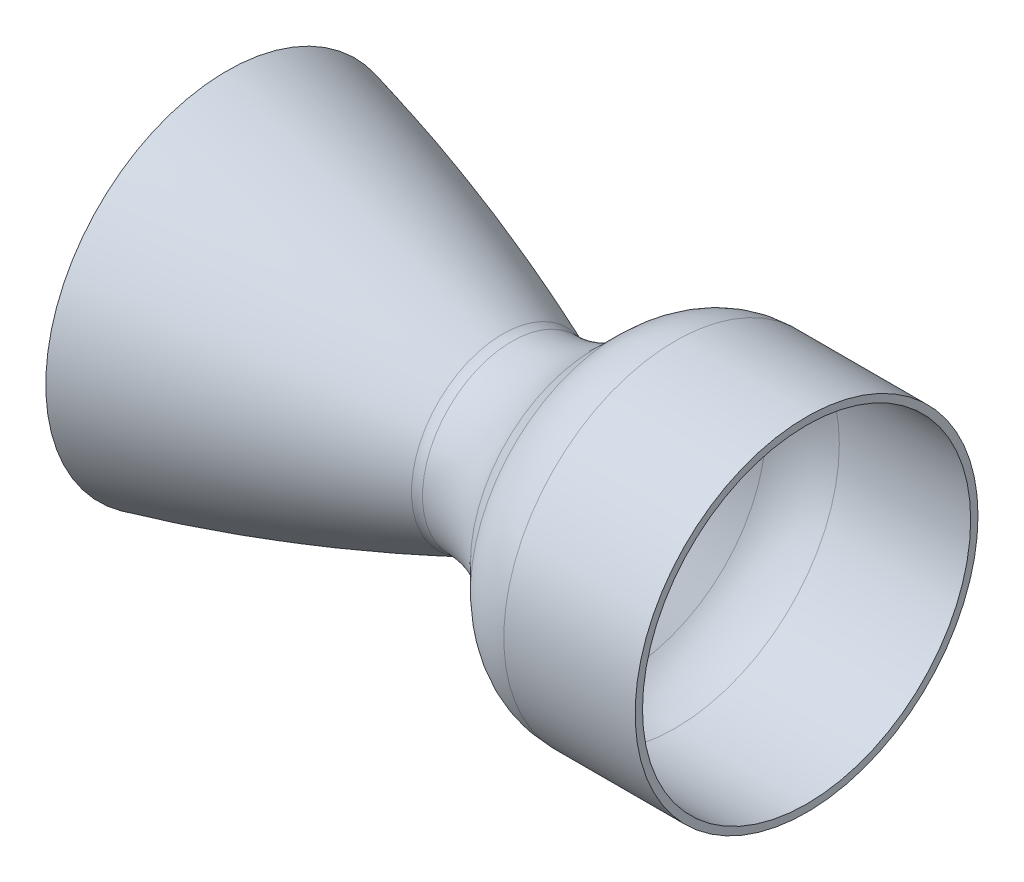
ISO-10303-21;
HEADER;
FILE_DESCRIPTION(('STEP AP214'),'2;1');
FILE_NAME('part.step','',(''),(''),'','','');
FILE_SCHEMA(('AUTOMOTIVE_DESIGN { 1 0 10303 214 1 1 1 1 }'));
ENDSEC;
DATA;
#1=APPLICATION_CONTEXT('core data for automotive mechanical design processes');
#2=APPLICATION_PROTOCOL_DEFINITION('international standard','automotive_design',2000,#1);
#3=PRODUCT_CONTEXT('',#1,'mechanical');
#4=PRODUCT('Part','Part','',(#3));
#5=PRODUCT_RELATED_PRODUCT_CATEGORY('part','',(#4));
#6=PRODUCT_DEFINITION_FORMATION('','',#4);
#7=PRODUCT_DEFINITION_CONTEXT('part definition',#1,'design');
#8=PRODUCT_DEFINITION('design','',#6,#7);
#9=PRODUCT_DEFINITION_SHAPE('','',#8);
#10=(LENGTH_UNIT() NAMED_UNIT(*) SI_UNIT(.MILLI.,.METRE.));
#11=(NAMED_UNIT(*) PLANE_ANGLE_UNIT() SI_UNIT($,.RADIAN.));
#12=(NAMED_UNIT(*) SI_UNIT($,.STERADIAN.) SOLID_ANGLE_UNIT());
#13=UNCERTAINTY_MEASURE_WITH_UNIT(LENGTH_MEASURE(1.E-05),#10,'distance_accuracy_value','');
#14=(GEOMETRIC_REPRESENTATION_CONTEXT(3) GLOBAL_UNCERTAINTY_ASSIGNED_CONTEXT((#13)) GLOBAL_UNIT_ASSIGNED_CONTEXT((#10,
#11,#12)) REPRESENTATION_CONTEXT('',''));
#15=CARTESIAN_POINT('',(0.,0.,0.));
#16=DIRECTION('',(0.,0.,1.));
#17=DIRECTION('',(1.,0.,0.));
#18=AXIS2_PLACEMENT_3D('',#15,#16,#17);
#19=CARTESIAN_POINT('',(1.63098502535199,0.,0.));
#20=DIRECTION('',(1.,0.,0.));
#21=DIRECTION('',(0.,0.,-1.));
#22=AXIS2_PLACEMENT_3D('',#19,#20,#21);
#23=TOROIDAL_SURFACE('',#22,15.4784,3.2784);
#24=CARTESIAN_POINT('',(1.63098502535199,0.,0.));
#25=DIRECTION('',(1.,0.,0.));
#26=DIRECTION('',(0.,0.,-1.));
#27=AXIS2_PLACEMENT_3D('',#24,#25,#26);
#28=CIRCLE('',#27,12.2);
#29=CARTESIAN_POINT('',(1.63098502535199,0.,-12.2));
#30=VERTEX_POINT('',#29);
#31=EDGE_CURVE('E100',#30,#30,#28,.T.);
#32=ORIENTED_EDGE('',*,*,#31,.F.);
#33=EDGE_LOOP('',(#32));
#34=FACE_BOUND('',#33,.T.);
#35=CARTESIAN_POINT('',(0.381213777428943,0.,0.));
#36=DIRECTION('',(1.,0.,0.));
#37=DIRECTION('',(0.,0.,-1.));
#38=AXIS2_PLACEMENT_3D('',#35,#36,#37);
#39=CIRCLE('',#38,12.4475620980553);
#40=CARTESIAN_POINT('',(0.381213777428943,0.,-12.4475620980553));
#41=VERTEX_POINT('',#40);
#42=EDGE_CURVE('E10',#41,#41,#39,.T.);
#43=ORIENTED_EDGE('',*,*,#42,.T.);
#44=EDGE_LOOP('',(#43));
#45=FACE_BOUND('',#44,.T.);
#46=ADVANCED_FACE('F41',(#34,#45),#23,.F.);
#47=CARTESIAN_POINT('',(0.381213777428944,12.4475620980553,0.));
#48=CARTESIAN_POINT('',(-18.5503141448873,20.2544105180687,0.));
#49=CARTESIAN_POINT('',(-37.2633725030895,24.7313471875832,0.));
#50=B_SPLINE_CURVE_WITH_KNOTS('',2,(#47,#48,#49),.UNSPECIFIED.,.F.,.F.,(3,3),(0.,1.),.UNSPECIFIED.);
#51=CARTESIAN_POINT('',(0.,0.,0.));
#52=DIRECTION('',(1.,0.,0.));
#53=AXIS1_PLACEMENT('',#51,#52);
#54=SURFACE_OF_REVOLUTION('',#50,#53);
#55=CARTESIAN_POINT('',(-37.2633725030895,0.,0.));
#56=DIRECTION('',(1.,0.,0.));
#57=DIRECTION('',(0.,0.,-1.));
#58=AXIS2_PLACEMENT_3D('',#55,#56,#57);
#59=CIRCLE('',#58,24.7313471875832);
#60=CARTESIAN_POINT('',(-37.2633725030895,0.,-24.7313471875832));
#61=VERTEX_POINT('',#60);
#62=EDGE_CURVE('E48',#61,#61,#59,.T.);
#63=ORIENTED_EDGE('',*,*,#62,.T.);
#64=EDGE_LOOP('',(#63));
#65=FACE_BOUND('',#64,.T.);
#66=ORIENTED_EDGE('',*,*,#42,.F.);
#67=EDGE_LOOP('',(#66));
#68=FACE_BOUND('',#67,.T.);
#69=ADVANCED_FACE('F124',(#65,#68),#54,.F.);
#70=CARTESIAN_POINT('',(-37.4960274637776,0.,0.));
#71=DIRECTION('',(1.,0.,0.));
#72=DIRECTION('',(0.,0.,-1.));
#73=AXIS2_PLACEMENT_3D('',#70,#71,#72);
#74=CONICAL_SURFACE('',#73,23.758787847868,1.33598966119205);
#75=ORIENTED_EDGE('',*,*,#62,.F.);
#76=EDGE_LOOP('',(#75));
#77=FACE_BOUND('',#76,.T.);
#78=CARTESIAN_POINT('',(-37.4960274637776,0.,0.));
#79=DIRECTION('',(1.,0.,0.));
#80=DIRECTION('',(0.,0.,-1.));
#81=AXIS2_PLACEMENT_3D('',#78,#79,#80);
#82=CIRCLE('',#81,23.758787847868);
#83=CARTESIAN_POINT('',(-37.4960274637776,0.,-23.758787847868));
#84=VERTEX_POINT('',#83);
#85=EDGE_CURVE('E53',#84,#84,#82,.T.);
#86=ORIENTED_EDGE('',*,*,#85,.T.);
#87=EDGE_LOOP('',(#86));
#88=FACE_BOUND('',#87,.T.);
#89=ADVANCED_FACE('F120',(#77,#88),#74,.T.);
#90=CARTESIAN_POINT('',(0.,11.5230751831136,0.));
#91=CARTESIAN_POINT('',(-18.8638218788946,19.3016047425654,0.));
#92=CARTESIAN_POINT('',(-37.4960274637776,23.758787847868,0.));
#93=B_SPLINE_CURVE_WITH_KNOTS('',2,(#90,#91,#92),.UNSPECIFIED.,.F.,.F.,(3,3),(0.,1.),.UNSPECIFIED.);
#94=CARTESIAN_POINT('',(0.,0.,0.));
#95=DIRECTION('',(1.,0.,0.));
#96=AXIS1_PLACEMENT('',#94,#95);
#97=SURFACE_OF_REVOLUTION('',#93,#96);
#98=ORIENTED_EDGE('',*,*,#85,.F.);
#99=EDGE_LOOP('',(#98));
#100=FACE_BOUND('',#99,.T.);
#101=CARTESIAN_POINT('',(0.,0.,0.));
#102=DIRECTION('',(1.,0.,0.));
#103=DIRECTION('',(0.,0.,-1.));
#104=AXIS2_PLACEMENT_3D('',#101,#102,#103);
#105=CIRCLE('',#104,11.5230751831136);
#106=CARTESIAN_POINT('',(0.,0.,-11.5230751831136));
#107=VERTEX_POINT('',#106);
#108=EDGE_CURVE('E58',#107,#107,#105,.T.);
#109=ORIENTED_EDGE('',*,*,#108,.T.);
#110=EDGE_LOOP('',(#109));
#111=FACE_BOUND('',#110,.T.);
#112=ADVANCED_FACE('F115',(#100,#111),#97,.T.);
#113=CARTESIAN_POINT('',(1.63098502535199,0.,0.));
#114=DIRECTION('',(1.,0.,0.));
#115=DIRECTION('',(0.,0.,-1.));
#116=AXIS2_PLACEMENT_3D('',#113,#114,#115);
#117=TOROIDAL_SURFACE('',#116,15.4784,4.2784);
#118=ORIENTED_EDGE('',*,*,#108,.F.);
#119=EDGE_LOOP('',(#118));
#120=FACE_BOUND('',#119,.T.);
#121=CARTESIAN_POINT('',(1.63098502535199,0.,0.));
#122=DIRECTION('',(1.,0.,0.));
#123=DIRECTION('',(0.,0.,-1.));
#124=AXIS2_PLACEMENT_3D('',#121,#122,#123);
#125=CIRCLE('',#124,11.2);
#126=CARTESIAN_POINT('',(1.63098502535199,0.,-11.2));
#127=VERTEX_POINT('',#126);
#128=EDGE_CURVE('E64',#127,#127,#125,.T.);
#129=ORIENTED_EDGE('',*,*,#128,.T.);
#130=EDGE_LOOP('',(#129));
#131=FACE_BOUND('',#130,.T.);
#132=ADVANCED_FACE('F119',(#120,#131),#117,.T.);
#133=CARTESIAN_POINT('',(1.63098502535199,0.,0.));
#134=DIRECTION('',(1.,0.,0.));
#135=DIRECTION('',(0.,0.,-1.));
#136=AXIS2_PLACEMENT_3D('',#133,#134,#135);
#137=TOROIDAL_SURFACE('',#136,28.,16.8);
#138=ORIENTED_EDGE('',*,*,#128,.F.);
#139=EDGE_LOOP('',(#138));
#140=FACE_BOUND('',#139,.T.);
#141=CARTESIAN_POINT('',(13.510378949286,0.,0.));
#142=DIRECTION('',(1.,0.,0.));
#143=DIRECTION('',(0.,0.,-1.));
#144=AXIS2_PLACEMENT_3D('',#141,#142,#143);
#145=CIRCLE('',#144,16.120606076066);
#146=CARTESIAN_POINT('',(13.510378949286,0.,-16.120606076066));
#147=VERTEX_POINT('',#146);
#148=EDGE_CURVE('E68',#147,#147,#145,.T.);
#149=ORIENTED_EDGE('',*,*,#148,.T.);
#150=EDGE_LOOP('',(#149));
#151=FACE_BOUND('',#150,.T.);
#152=ADVANCED_FACE('F180',(#140,#151),#137,.T.);
#153=CARTESIAN_POINT('',(16.8608406850854,0.,0.));
#154=DIRECTION('',(1.,0.,0.));
#155=DIRECTION('',(0.,0.,-1.));
#156=AXIS2_PLACEMENT_3D('',#153,#154,#155);
#157=CONICAL_SURFACE('',#156,19.4710678118655,0.78539816339745);
#158=ORIENTED_EDGE('',*,*,#148,.F.);
#159=EDGE_LOOP('',(#158));
#160=FACE_BOUND('',#159,.T.);
#161=CARTESIAN_POINT('',(16.8608406850854,0.,0.));
#162=DIRECTION('',(1.,0.,0.));
#163=DIRECTION('',(0.,0.,-1.));
#164=AXIS2_PLACEMENT_3D('',#161,#162,#163);
#165=CIRCLE('',#164,19.4710678118655);
#166=CARTESIAN_POINT('',(16.8608406850854,0.,-19.4710678118655));
#167=VERTEX_POINT('',#166);
#168=EDGE_CURVE('E72',#167,#167,#165,.T.);
#169=ORIENTED_EDGE('',*,*,#168,.T.);
#170=EDGE_LOOP('',(#169));
#171=FACE_BOUND('',#170,.T.);
#172=ADVANCED_FACE('F174',(#160,#171),#157,.F.);
#173=CARTESIAN_POINT('',(23.9319084969509,0.,0.));
#174=DIRECTION('',(1.,0.,0.));
#175=DIRECTION('',(0.,0.,-1.));
#176=AXIS2_PLACEMENT_3D('',#173,#174,#175);
#177=TOROIDAL_SURFACE('',#176,12.4,10.);
#178=ORIENTED_EDGE('',*,*,#168,.F.);
#179=EDGE_LOOP('',(#178));
#180=FACE_BOUND('',#179,.T.);
#181=CARTESIAN_POINT('',(23.9319084969509,0.,0.));
#182=DIRECTION('',(1.,0.,0.));
#183=DIRECTION('',(0.,0.,-1.));
#184=AXIS2_PLACEMENT_3D('',#181,#182,#183);
#185=CIRCLE('',#184,22.4);
#186=CARTESIAN_POINT('',(23.9319084969509,0.,-22.4));
#187=VERTEX_POINT('',#186);
#188=EDGE_CURVE('E76',#187,#187,#185,.T.);
#189=ORIENTED_EDGE('',*,*,#188,.T.);
#190=EDGE_LOOP('',(#189));
#191=FACE_BOUND('',#190,.T.);
#192=ADVANCED_FACE('F168',(#180,#191),#177,.F.);
#193=CARTESIAN_POINT('',(0.,0.,0.));
#194=DIRECTION('',(1.,0.,0.));
#195=DIRECTION('',(0.,0.,-1.));
#196=AXIS2_PLACEMENT_3D('',#193,#194,#195);
#197=CYLINDRICAL_SURFACE('',#196,22.4);
#198=ORIENTED_EDGE('',*,*,#188,.F.);
#199=EDGE_LOOP('',(#198));
#200=FACE_BOUND('',#199,.T.);
#201=CARTESIAN_POINT('',(41.8608406850854,0.,0.));
#202=DIRECTION('',(1.,0.,0.));
#203=DIRECTION('',(0.,0.,-1.));
#204=AXIS2_PLACEMENT_3D('',#201,#202,#203);
#205=CIRCLE('',#204,22.4);
#206=CARTESIAN_POINT('',(41.8608406850854,0.,-22.4));
#207=VERTEX_POINT('',#206);
#208=EDGE_CURVE('E80',#207,#207,#205,.T.);
#209=ORIENTED_EDGE('',*,*,#208,.T.);
#210=EDGE_LOOP('',(#209));
#211=FACE_BOUND('',#210,.T.);
#212=ADVANCED_FACE('F163',(#200,#211),#197,.F.);
#213=CARTESIAN_POINT('',(41.8608406850854,0.,0.));
#214=DIRECTION('',(1.,0.,0.));
#215=DIRECTION('',(0.,0.,-1.));
#216=AXIS2_PLACEMENT_3D('',#213,#214,#215);
#217=PLANE('',#216);
#218=CARTESIAN_POINT('',(41.8608406850854,0.,0.));
#219=DIRECTION('',(1.,0.,0.));
#220=DIRECTION('',(0.,0.,-1.));
#221=AXIS2_PLACEMENT_3D('',#218,#219,#220);
#222=CIRCLE('',#221,23.4);
#223=CARTESIAN_POINT('',(41.8608406850854,0.,-23.4));
#224=VERTEX_POINT('',#223);
#225=EDGE_CURVE('E84',#224,#224,#222,.T.);
#226=ORIENTED_EDGE('',*,*,#225,.T.);
#227=EDGE_LOOP('',(#226));
#228=FACE_BOUND('',#227,.T.);
#229=ORIENTED_EDGE('',*,*,#208,.F.);
#230=EDGE_LOOP('',(#229));
#231=FACE_BOUND('',#230,.T.);
#232=ADVANCED_FACE('F157',(#228,#231),#217,.T.);
#233=CARTESIAN_POINT('',(0.,0.,0.));
#234=DIRECTION('',(1.,0.,0.));
#235=DIRECTION('',(0.,0.,-1.));
#236=AXIS2_PLACEMENT_3D('',#233,#234,#235);
#237=CYLINDRICAL_SURFACE('',#236,23.4);
#238=CARTESIAN_POINT('',(23.9319084969509,0.,0.));
#239=DIRECTION('',(1.,0.,0.));
#240=DIRECTION('',(0.,0.,-1.));
#241=AXIS2_PLACEMENT_3D('',#238,#239,#240);
#242=CIRCLE('',#241,23.4);
#243=CARTESIAN_POINT('',(23.9319084969509,0.,-23.4));
#244=VERTEX_POINT('',#243);
#245=EDGE_CURVE('E88',#244,#244,#242,.T.);
#246=ORIENTED_EDGE('',*,*,#245,.T.);
#247=EDGE_LOOP('',(#246));
#248=FACE_BOUND('',#247,.T.);
#249=ORIENTED_EDGE('',*,*,#225,.F.);
#250=EDGE_LOOP('',(#249));
#251=FACE_BOUND('',#250,.T.);
#252=ADVANCED_FACE('F151',(#248,#251),#237,.T.);
#253=CARTESIAN_POINT('',(23.9319084969509,0.,0.));
#254=DIRECTION('',(1.,0.,0.));
#255=DIRECTION('',(0.,0.,-1.));
#256=AXIS2_PLACEMENT_3D('',#253,#254,#255);
#257=TOROIDAL_SURFACE('',#256,12.4,11.);
#258=CARTESIAN_POINT('',(16.1537339038989,0.,0.));
#259=DIRECTION('',(1.,0.,0.));
#260=DIRECTION('',(0.,0.,-1.));
#261=AXIS2_PLACEMENT_3D('',#258,#259,#260);
#262=CIRCLE('',#261,20.178174593052);
#263=CARTESIAN_POINT('',(16.1537339038989,0.,-20.178174593052));
#264=VERTEX_POINT('',#263);
#265=EDGE_CURVE('E92',#264,#264,#262,.T.);
#266=ORIENTED_EDGE('',*,*,#265,.T.);
#267=EDGE_LOOP('',(#266));
#268=FACE_BOUND('',#267,.T.);
#269=ORIENTED_EDGE('',*,*,#245,.F.);
#270=EDGE_LOOP('',(#269));
#271=FACE_BOUND('',#270,.T.);
#272=ADVANCED_FACE('F145',(#268,#271),#257,.T.);
#273=CARTESIAN_POINT('',(16.1537339038989,0.,0.));
#274=DIRECTION('',(1.,0.,0.));
#275=DIRECTION('',(0.,0.,-1.));
#276=AXIS2_PLACEMENT_3D('',#273,#274,#275);
#277=CONICAL_SURFACE('',#276,20.178174593052,0.785398163397451);
#278=CARTESIAN_POINT('',(12.8032721680995,0.,0.));
#279=DIRECTION('',(1.,0.,0.));
#280=DIRECTION('',(0.,0.,-1.));
#281=AXIS2_PLACEMENT_3D('',#278,#279,#280);
#282=CIRCLE('',#281,16.8277128572526);
#283=CARTESIAN_POINT('',(12.8032721680995,0.,-16.8277128572526));
#284=VERTEX_POINT('',#283);
#285=EDGE_CURVE('E96',#284,#284,#282,.T.);
#286=ORIENTED_EDGE('',*,*,#285,.T.);
#287=EDGE_LOOP('',(#286));
#288=FACE_BOUND('',#287,.T.);
#289=ORIENTED_EDGE('',*,*,#265,.F.);
#290=EDGE_LOOP('',(#289));
#291=FACE_BOUND('',#290,.T.);
#292=ADVANCED_FACE('F139',(#288,#291),#277,.T.);
#293=CARTESIAN_POINT('',(1.63098502535199,0.,0.));
#294=DIRECTION('',(1.,0.,0.));
#295=DIRECTION('',(0.,0.,-1.));
#296=AXIS2_PLACEMENT_3D('',#293,#294,#295);
#297=TOROIDAL_SURFACE('',#296,28.,15.8);
#298=ORIENTED_EDGE('',*,*,#31,.T.);
#299=EDGE_LOOP('',(#298));
#300=FACE_BOUND('',#299,.T.);
#301=ORIENTED_EDGE('',*,*,#285,.F.);
#302=EDGE_LOOP('',(#301));
#303=FACE_BOUND('',#302,.T.);
#304=ADVANCED_FACE('F136',(#300,#303),#297,.F.);
#305=CLOSED_SHELL('',(#46,#69,#89,#112,#132,#152,#172,#192,#212,#232,#252,#272,#292,#304));
#306=MANIFOLD_SOLID_BREP('B2',#305);
#307=ADVANCED_BREP_SHAPE_REPRESENTATION('',(#18,#306),#14);
#308=SHAPE_DEFINITION_REPRESENTATION(#9,#307);
ENDSEC;
END-ISO-10303-21;
